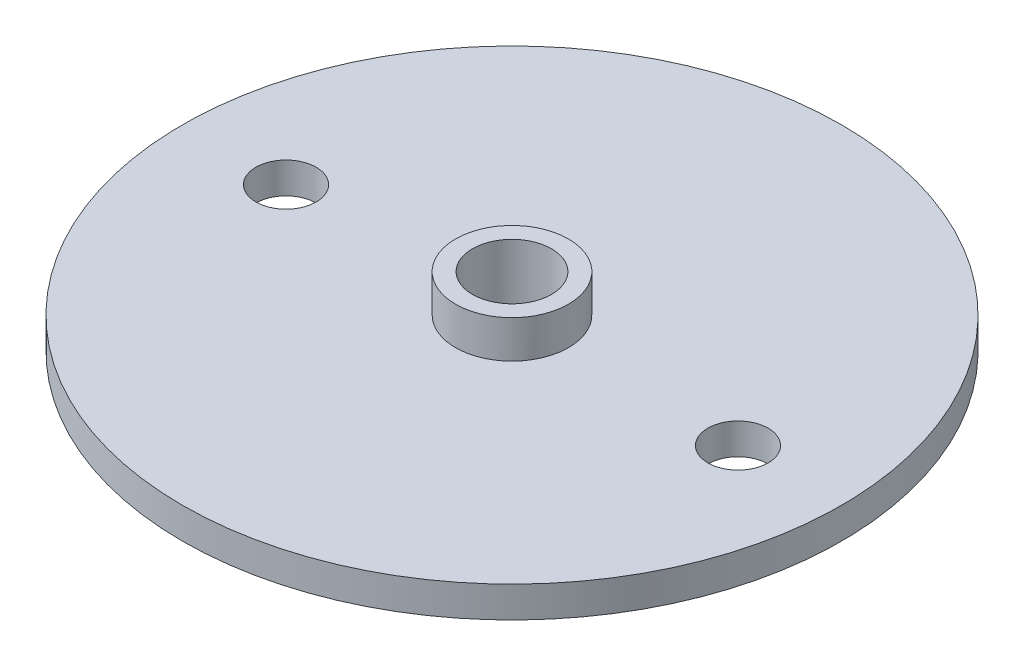
ISO-10303-21;
HEADER;
FILE_DESCRIPTION(('STEP AP214'),'2;1');
FILE_NAME('part.step','',(''),(''),'','','');
FILE_SCHEMA(('AUTOMOTIVE_DESIGN { 1 0 10303 214 1 1 1 1 }'));
ENDSEC;
DATA;
#1=APPLICATION_CONTEXT('core data for automotive mechanical design processes');
#2=APPLICATION_PROTOCOL_DEFINITION('international standard','automotive_design',2000,#1);
#3=PRODUCT_CONTEXT('',#1,'mechanical');
#4=PRODUCT('Part','Part','',(#3));
#5=PRODUCT_RELATED_PRODUCT_CATEGORY('part','',(#4));
#6=PRODUCT_DEFINITION_FORMATION('','',#4);
#7=PRODUCT_DEFINITION_CONTEXT('part definition',#1,'design');
#8=PRODUCT_DEFINITION('design','',#6,#7);
#9=PRODUCT_DEFINITION_SHAPE('','',#8);
#10=(LENGTH_UNIT() NAMED_UNIT(*) SI_UNIT(.MILLI.,.METRE.));
#11=(NAMED_UNIT(*) PLANE_ANGLE_UNIT() SI_UNIT($,.RADIAN.));
#12=(NAMED_UNIT(*) SI_UNIT($,.STERADIAN.) SOLID_ANGLE_UNIT());
#13=UNCERTAINTY_MEASURE_WITH_UNIT(LENGTH_MEASURE(1.E-05),#10,'distance_accuracy_value','');
#14=(GEOMETRIC_REPRESENTATION_CONTEXT(3) GLOBAL_UNCERTAINTY_ASSIGNED_CONTEXT((#13)) GLOBAL_UNIT_ASSIGNED_CONTEXT((#10,
#11,#12)) REPRESENTATION_CONTEXT('',''));
#15=CARTESIAN_POINT('',(0.,0.,0.));
#16=DIRECTION('',(0.,0.,1.));
#17=DIRECTION('',(1.,0.,0.));
#18=AXIS2_PLACEMENT_3D('',#15,#16,#17);
#19=CARTESIAN_POINT('',(0.,3.,0.));
#20=DIRECTION('',(0.,-1.,0.));
#21=DIRECTION('',(0.,0.,-1.));
#22=AXIS2_PLACEMENT_3D('',#19,#20,#21);
#23=CYLINDRICAL_SURFACE('',#22,3.);
#24=CARTESIAN_POINT('',(0.,3.,0.));
#25=DIRECTION('',(0.,1.,0.));
#26=DIRECTION('',(0.,0.,1.));
#27=AXIS2_PLACEMENT_3D('',#24,#25,#26);
#28=CIRCLE('',#27,3.);
#29=CARTESIAN_POINT('',(0.,3.,3.));
#30=VERTEX_POINT('',#29);
#31=EDGE_CURVE('E36',#30,#30,#28,.T.);
#32=ORIENTED_EDGE('',*,*,#31,.F.);
#33=EDGE_LOOP('',(#32));
#34=FACE_BOUND('',#33,.T.);
#35=CARTESIAN_POINT('',(0.,1.,0.));
#36=DIRECTION('',(0.,-1.,0.));
#37=DIRECTION('',(0.,0.,-1.));
#38=AXIS2_PLACEMENT_3D('',#35,#36,#37);
#39=CIRCLE('',#38,3.);
#40=CARTESIAN_POINT('',(0.,1.,-3.));
#41=VERTEX_POINT('',#40);
#42=EDGE_CURVE('E10',#41,#41,#39,.T.);
#43=ORIENTED_EDGE('',*,*,#42,.F.);
#44=EDGE_LOOP('',(#43));
#45=FACE_BOUND('',#44,.T.);
#46=ADVANCED_FACE('F33',(#34,#45),#23,.T.);
#47=CARTESIAN_POINT('',(0.,3.,0.));
#48=DIRECTION('',(0.,1.,0.));
#49=DIRECTION('',(0.,0.,1.));
#50=AXIS2_PLACEMENT_3D('',#47,#48,#49);
#51=PLANE('',#50);
#52=ORIENTED_EDGE('',*,*,#31,.T.);
#53=EDGE_LOOP('',(#52));
#54=FACE_BOUND('',#53,.T.);
#55=CARTESIAN_POINT('',(0.,3.,0.));
#56=DIRECTION('',(0.,1.,0.));
#57=DIRECTION('',(0.,0.,1.));
#58=AXIS2_PLACEMENT_3D('',#55,#56,#57);
#59=CIRCLE('',#58,2.1);
#60=CARTESIAN_POINT('',(0.,3.,2.1));
#61=VERTEX_POINT('',#60);
#62=EDGE_CURVE('E44',#61,#61,#59,.T.);
#63=ORIENTED_EDGE('',*,*,#62,.F.);
#64=EDGE_LOOP('',(#63));
#65=FACE_BOUND('',#64,.T.);
#66=ADVANCED_FACE('F103',(#54,#65),#51,.T.);
#67=CARTESIAN_POINT('',(0.,3.,0.));
#68=DIRECTION('',(0.,-1.,0.));
#69=DIRECTION('',(0.,0.,-1.));
#70=AXIS2_PLACEMENT_3D('',#67,#68,#69);
#71=CYLINDRICAL_SURFACE('',#70,2.1);
#72=ORIENTED_EDGE('',*,*,#62,.T.);
#73=EDGE_LOOP('',(#72));
#74=FACE_BOUND('',#73,.T.);
#75=CARTESIAN_POINT('',(0.,-0.65,0.));
#76=DIRECTION('',(0.,-1.,0.));
#77=DIRECTION('',(0.,0.,-1.));
#78=AXIS2_PLACEMENT_3D('',#75,#76,#77);
#79=CIRCLE('',#78,2.1);
#80=CARTESIAN_POINT('',(0.,-0.65,-2.1));
#81=VERTEX_POINT('',#80);
#82=EDGE_CURVE('E56',#81,#81,#79,.T.);
#83=ORIENTED_EDGE('',*,*,#82,.T.);
#84=EDGE_LOOP('',(#83));
#85=FACE_BOUND('',#84,.T.);
#86=ADVANCED_FACE('F89',(#74,#85),#71,.F.);
#87=CARTESIAN_POINT('',(0.,1.,0.));
#88=DIRECTION('',(0.,-1.,0.));
#89=DIRECTION('',(0.,0.,-1.));
#90=AXIS2_PLACEMENT_3D('',#87,#88,#89);
#91=PLANE('',#90);
#92=CARTESIAN_POINT('',(-12.,1.,0.));
#93=DIRECTION('',(0.,1.,0.));
#94=DIRECTION('',(0.,0.,1.));
#95=AXIS2_PLACEMENT_3D('',#92,#93,#94);
#96=CIRCLE('',#95,1.6);
#97=CARTESIAN_POINT('',(-12.,1.,1.6));
#98=VERTEX_POINT('',#97);
#99=EDGE_CURVE('E69',#98,#98,#96,.T.);
#100=ORIENTED_EDGE('',*,*,#99,.F.);
#101=EDGE_LOOP('',(#100));
#102=FACE_BOUND('',#101,.T.);
#103=CARTESIAN_POINT('',(12.,1.,0.));
#104=DIRECTION('',(0.,1.,0.));
#105=DIRECTION('',(0.,0.,-1.));
#106=AXIS2_PLACEMENT_3D('',#103,#104,#105);
#107=CIRCLE('',#106,1.6);
#108=CARTESIAN_POINT('',(12.,1.,-1.6));
#109=VERTEX_POINT('',#108);
#110=EDGE_CURVE('E63',#109,#109,#107,.T.);
#111=ORIENTED_EDGE('',*,*,#110,.F.);
#112=EDGE_LOOP('',(#111));
#113=FACE_BOUND('',#112,.T.);
#114=CARTESIAN_POINT('',(0.,1.,0.));
#115=DIRECTION('',(0.,-1.,0.));
#116=DIRECTION('',(0.,0.,-1.));
#117=AXIS2_PLACEMENT_3D('',#114,#115,#116);
#118=CIRCLE('',#117,17.5);
#119=CARTESIAN_POINT('',(0.,1.,-17.5));
#120=VERTEX_POINT('',#119);
#121=EDGE_CURVE('E46',#120,#120,#118,.T.);
#122=ORIENTED_EDGE('',*,*,#121,.F.);
#123=EDGE_LOOP('',(#122));
#124=FACE_BOUND('',#123,.T.);
#125=ORIENTED_EDGE('',*,*,#42,.T.);
#126=EDGE_LOOP('',(#125));
#127=FACE_BOUND('',#126,.T.);
#128=ADVANCED_FACE('F85',(#102,#113,#124,#127),#91,.F.);
#129=CARTESIAN_POINT('',(0.,1.,0.));
#130=DIRECTION('',(0.,-1.,0.));
#131=DIRECTION('',(0.,0.,-1.));
#132=AXIS2_PLACEMENT_3D('',#129,#130,#131);
#133=CYLINDRICAL_SURFACE('',#132,17.5);
#134=ORIENTED_EDGE('',*,*,#121,.T.);
#135=EDGE_LOOP('',(#134));
#136=FACE_BOUND('',#135,.T.);
#137=CARTESIAN_POINT('',(0.,-0.65,0.));
#138=DIRECTION('',(0.,-1.,0.));
#139=DIRECTION('',(0.,0.,-1.));
#140=AXIS2_PLACEMENT_3D('',#137,#138,#139);
#141=CIRCLE('',#140,17.5);
#142=CARTESIAN_POINT('',(0.,-0.65,-17.5));
#143=VERTEX_POINT('',#142);
#144=EDGE_CURVE('E52',#143,#143,#141,.T.);
#145=ORIENTED_EDGE('',*,*,#144,.F.);
#146=EDGE_LOOP('',(#145));
#147=FACE_BOUND('',#146,.T.);
#148=ADVANCED_FACE('F88',(#136,#147),#133,.T.);
#149=CARTESIAN_POINT('',(0.,-0.65,0.));
#150=DIRECTION('',(0.,-1.,0.));
#151=DIRECTION('',(0.,0.,-1.));
#152=AXIS2_PLACEMENT_3D('',#149,#150,#151);
#153=PLANE('',#152);
#154=CARTESIAN_POINT('',(-12.,-0.65,0.));
#155=DIRECTION('',(0.,1.,0.));
#156=DIRECTION('',(0.,0.,1.));
#157=AXIS2_PLACEMENT_3D('',#154,#155,#156);
#158=CIRCLE('',#157,1.6);
#159=CARTESIAN_POINT('',(-12.,-0.65,1.6));
#160=VERTEX_POINT('',#159);
#161=EDGE_CURVE('E60',#160,#160,#158,.T.);
#162=ORIENTED_EDGE('',*,*,#161,.T.);
#163=EDGE_LOOP('',(#162));
#164=FACE_BOUND('',#163,.T.);
#165=CARTESIAN_POINT('',(12.,-0.65,0.));
#166=DIRECTION('',(0.,1.,0.));
#167=DIRECTION('',(0.,0.,-1.));
#168=AXIS2_PLACEMENT_3D('',#165,#166,#167);
#169=CIRCLE('',#168,1.6);
#170=CARTESIAN_POINT('',(12.,-0.65,-1.6));
#171=VERTEX_POINT('',#170);
#172=EDGE_CURVE('E66',#171,#171,#169,.T.);
#173=ORIENTED_EDGE('',*,*,#172,.T.);
#174=EDGE_LOOP('',(#173));
#175=FACE_BOUND('',#174,.T.);
#176=ORIENTED_EDGE('',*,*,#144,.T.);
#177=EDGE_LOOP('',(#176));
#178=FACE_BOUND('',#177,.T.);
#179=ORIENTED_EDGE('',*,*,#82,.F.);
#180=EDGE_LOOP('',(#179));
#181=FACE_BOUND('',#180,.T.);
#182=ADVANCED_FACE('F75',(#164,#175,#178,#181),#153,.T.);
#183=CARTESIAN_POINT('',(12.,-0.65,0.));
#184=DIRECTION('',(0.,1.,0.));
#185=DIRECTION('',(0.,0.,1.));
#186=AXIS2_PLACEMENT_3D('',#183,#184,#185);
#187=CYLINDRICAL_SURFACE('',#186,1.6);
#188=ORIENTED_EDGE('',*,*,#172,.F.);
#189=EDGE_LOOP('',(#188));
#190=FACE_BOUND('',#189,.T.);
#191=ORIENTED_EDGE('',*,*,#110,.T.);
#192=EDGE_LOOP('',(#191));
#193=FACE_BOUND('',#192,.T.);
#194=ADVANCED_FACE('F81',(#190,#193),#187,.F.);
#195=CARTESIAN_POINT('',(-12.,-0.65,0.));
#196=DIRECTION('',(0.,1.,0.));
#197=DIRECTION('',(0.,0.,1.));
#198=AXIS2_PLACEMENT_3D('',#195,#196,#197);
#199=CYLINDRICAL_SURFACE('',#198,1.6);
#200=ORIENTED_EDGE('',*,*,#161,.F.);
#201=EDGE_LOOP('',(#200));
#202=FACE_BOUND('',#201,.T.);
#203=ORIENTED_EDGE('',*,*,#99,.T.);
#204=EDGE_LOOP('',(#203));
#205=FACE_BOUND('',#204,.T.);
#206=ADVANCED_FACE('F78',(#202,#205),#199,.F.);
#207=CLOSED_SHELL('',(#46,#66,#86,#128,#148,#182,#194,#206));
#208=MANIFOLD_SOLID_BREP('B2',#207);
#209=ADVANCED_BREP_SHAPE_REPRESENTATION('',(#18,#208),#14);
#210=SHAPE_DEFINITION_REPRESENTATION(#9,#209);
ENDSEC;
END-ISO-10303-21;
